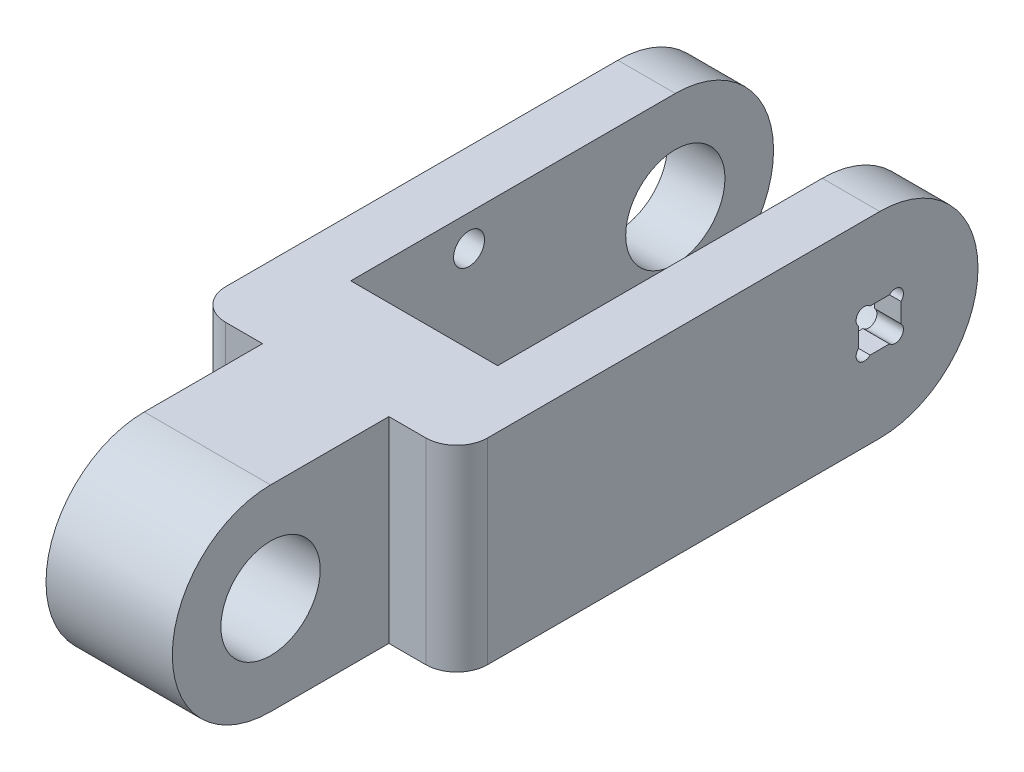
ISO-10303-21;
HEADER;
FILE_DESCRIPTION(('STEP AP214'),'2;1');
FILE_NAME('part.step','',(''),(''),'','','');
FILE_SCHEMA(('AUTOMOTIVE_DESIGN { 1 0 10303 214 1 1 1 1 }'));
ENDSEC;
DATA;
#1=APPLICATION_CONTEXT('core data for automotive mechanical design processes');
#2=APPLICATION_PROTOCOL_DEFINITION('international standard','automotive_design',2000,#1);
#3=PRODUCT_CONTEXT('',#1,'mechanical');
#4=PRODUCT('Part','Part','',(#3));
#5=PRODUCT_RELATED_PRODUCT_CATEGORY('part','',(#4));
#6=PRODUCT_DEFINITION_FORMATION('','',#4);
#7=PRODUCT_DEFINITION_CONTEXT('part definition',#1,'design');
#8=PRODUCT_DEFINITION('design','',#6,#7);
#9=PRODUCT_DEFINITION_SHAPE('','',#8);
#10=(LENGTH_UNIT() NAMED_UNIT(*) SI_UNIT(.MILLI.,.METRE.));
#11=(NAMED_UNIT(*) PLANE_ANGLE_UNIT() SI_UNIT($,.RADIAN.));
#12=(NAMED_UNIT(*) SI_UNIT($,.STERADIAN.) SOLID_ANGLE_UNIT());
#13=UNCERTAINTY_MEASURE_WITH_UNIT(LENGTH_MEASURE(1.E-05),#10,'distance_accuracy_value','');
#14=(GEOMETRIC_REPRESENTATION_CONTEXT(3) GLOBAL_UNCERTAINTY_ASSIGNED_CONTEXT((#13)) GLOBAL_UNIT_ASSIGNED_CONTEXT((#10,
#11,#12)) REPRESENTATION_CONTEXT('',''));
#15=CARTESIAN_POINT('',(0.,0.,0.));
#16=DIRECTION('',(0.,0.,1.));
#17=DIRECTION('',(1.,0.,0.));
#18=AXIS2_PLACEMENT_3D('',#15,#16,#17);
#19=CARTESIAN_POINT('',(50.8,-19.05,0.));
#20=DIRECTION('',(0.,1.,0.));
#21=DIRECTION('',(0.,0.,1.));
#22=AXIS2_PLACEMENT_3D('',#19,#20,#21);
#23=PLANE('',#22);
#24=DIRECTION('',(1.,0.,0.));
#25=VECTOR('',#24,1.);
#26=CARTESIAN_POINT('',(50.8,-19.05,29.55));
#27=LINE('',#26,#25);
#28=CARTESIAN_POINT('',(6.,-19.05,29.55));
#29=VERTEX_POINT('',#28);
#30=CARTESIAN_POINT('',(13.15,-19.05,29.55));
#31=VERTEX_POINT('',#30);
#32=EDGE_CURVE('E243',#29,#31,#27,.T.);
#33=ORIENTED_EDGE('',*,*,#32,.F.);
#34=CARTESIAN_POINT('',(6.,-19.05,23.55));
#35=DIRECTION('',(0.,1.,0.));
#36=DIRECTION('',(0.,0.,1.));
#37=AXIS2_PLACEMENT_3D('',#34,#35,#36);
#38=CIRCLE('',#37,6.);
#39=CARTESIAN_POINT('',(0.,-19.05,23.55));
#40=VERTEX_POINT('',#39);
#41=EDGE_CURVE('E329',#29,#40,#38,.F.);
#42=ORIENTED_EDGE('',*,*,#41,.T.);
#43=DIRECTION('',(0.,0.,-1.));
#44=VECTOR('',#43,1.);
#45=CARTESIAN_POINT('',(0.,-19.05,0.));
#46=LINE('',#45,#44);
#47=CARTESIAN_POINT('',(0.,-19.05,-52.5));
#48=VERTEX_POINT('',#47);
#49=EDGE_CURVE('E281',#40,#48,#46,.T.);
#50=ORIENTED_EDGE('',*,*,#49,.T.);
#51=DIRECTION('',(-1.,0.,0.));
#52=VECTOR('',#51,1.);
#53=CARTESIAN_POINT('',(50.8,-19.05,-52.5));
#54=LINE('',#53,#52);
#55=CARTESIAN_POINT('',(11.15,-19.05,-52.5));
#56=VERTEX_POINT('',#55);
#57=EDGE_CURVE('E305',#56,#48,#54,.T.);
#58=ORIENTED_EDGE('',*,*,#57,.F.);
#59=DIRECTION('',(0.,0.,1.));
#60=VECTOR('',#59,1.);
#61=CARTESIAN_POINT('',(11.15,-19.05,0.));
#62=LINE('',#61,#60);
#63=CARTESIAN_POINT('',(11.15,-19.05,10.45));
#64=VERTEX_POINT('',#63);
#65=EDGE_CURVE('E271',#56,#64,#62,.T.);
#66=ORIENTED_EDGE('',*,*,#65,.T.);
#67=DIRECTION('',(1.,0.,0.));
#68=VECTOR('',#67,1.);
#69=CARTESIAN_POINT('',(50.8,-19.05,10.45));
#70=LINE('',#69,#68);
#71=CARTESIAN_POINT('',(39.65,-19.05,10.45));
#72=VERTEX_POINT('',#71);
#73=EDGE_CURVE('E274',#64,#72,#70,.T.);
#74=ORIENTED_EDGE('',*,*,#73,.T.);
#75=DIRECTION('',(0.,0.,1.));
#76=VECTOR('',#75,1.);
#77=CARTESIAN_POINT('',(39.65,-19.05,0.));
#78=LINE('',#77,#76);
#79=CARTESIAN_POINT('',(39.65,-19.05,-52.5));
#80=VERTEX_POINT('',#79);
#81=EDGE_CURVE('E279',#80,#72,#78,.T.);
#82=ORIENTED_EDGE('',*,*,#81,.F.);
#83=CARTESIAN_POINT('',(50.8,-19.05,-52.5));
#84=VERTEX_POINT('',#83);
#85=EDGE_CURVE('E306',#84,#80,#54,.T.);
#86=ORIENTED_EDGE('',*,*,#85,.F.);
#87=DIRECTION('',(0.,0.,-1.));
#88=VECTOR('',#87,1.);
#89=CARTESIAN_POINT('',(50.8,-19.05,0.));
#90=LINE('',#89,#88);
#91=CARTESIAN_POINT('',(50.8,-19.05,23.55));
#92=VERTEX_POINT('',#91);
#93=EDGE_CURVE('E282',#92,#84,#90,.T.);
#94=ORIENTED_EDGE('',*,*,#93,.F.);
#95=CARTESIAN_POINT('',(44.8,-19.05,23.55));
#96=DIRECTION('',(0.,1.,0.));
#97=DIRECTION('',(0.,0.,1.));
#98=AXIS2_PLACEMENT_3D('',#95,#96,#97);
#99=CIRCLE('',#98,6.);
#100=CARTESIAN_POINT('',(44.8,-19.05,29.55));
#101=VERTEX_POINT('',#100);
#102=EDGE_CURVE('E327',#92,#101,#99,.F.);
#103=ORIENTED_EDGE('',*,*,#102,.T.);
#104=DIRECTION('',(1.,0.,0.));
#105=VECTOR('',#104,1.);
#106=CARTESIAN_POINT('',(50.8,-19.05,29.55));
#107=LINE('',#106,#105);
#108=CARTESIAN_POINT('',(37.65,-19.05,29.55));
#109=VERTEX_POINT('',#108);
#110=EDGE_CURVE('E255',#109,#101,#107,.T.);
#111=ORIENTED_EDGE('',*,*,#110,.F.);
#112=DIRECTION('',(0.,0.,1.));
#113=VECTOR('',#112,1.);
#114=CARTESIAN_POINT('',(37.65,-19.05,0.));
#115=LINE('',#114,#113);
#116=CARTESIAN_POINT('',(37.65,-19.05,52.5));
#117=VERTEX_POINT('',#116);
#118=EDGE_CURVE('E258',#109,#117,#115,.T.);
#119=ORIENTED_EDGE('',*,*,#118,.T.);
#120=DIRECTION('',(-1.,0.,0.));
#121=VECTOR('',#120,1.);
#122=CARTESIAN_POINT('',(50.8,-19.05,52.5));
#123=LINE('',#122,#121);
#124=CARTESIAN_POINT('',(13.15,-19.05,52.5));
#125=VERTEX_POINT('',#124);
#126=EDGE_CURVE('E290',#117,#125,#123,.T.);
#127=ORIENTED_EDGE('',*,*,#126,.T.);
#128=DIRECTION('',(0.,0.,-1.));
#129=VECTOR('',#128,1.);
#130=CARTESIAN_POINT('',(13.15,-19.05,0.));
#131=LINE('',#130,#129);
#132=EDGE_CURVE('E245',#125,#31,#131,.T.);
#133=ORIENTED_EDGE('',*,*,#132,.T.);
#134=EDGE_LOOP('',(#33,#42,#50,#58,#66,#74,#82,#86,#94,#103,#111,#119,#127,#133));
#135=FACE_BOUND('',#134,.T.);
#136=ADVANCED_FACE('F39',(#135),#23,.F.);
#137=CARTESIAN_POINT('',(50.8,19.05,0.));
#138=DIRECTION('',(0.,1.,0.));
#139=DIRECTION('',(0.,0.,1.));
#140=AXIS2_PLACEMENT_3D('',#137,#138,#139);
#141=PLANE('',#140);
#142=DIRECTION('',(0.,0.,-1.));
#143=VECTOR('',#142,1.);
#144=CARTESIAN_POINT('',(0.,19.05,0.));
#145=LINE('',#144,#143);
#146=CARTESIAN_POINT('',(0.,19.05,23.55));
#147=VERTEX_POINT('',#146);
#148=CARTESIAN_POINT('',(0.,19.05,-52.5));
#149=VERTEX_POINT('',#148);
#150=EDGE_CURVE('E285',#147,#149,#145,.T.);
#151=ORIENTED_EDGE('',*,*,#150,.F.);
#152=CARTESIAN_POINT('',(6.,19.05,23.55));
#153=DIRECTION('',(0.,1.,0.));
#154=DIRECTION('',(0.,0.,1.));
#155=AXIS2_PLACEMENT_3D('',#152,#153,#154);
#156=CIRCLE('',#155,6.);
#157=CARTESIAN_POINT('',(6.,19.05,29.55));
#158=VERTEX_POINT('',#157);
#159=EDGE_CURVE('E334',#147,#158,#156,.T.);
#160=ORIENTED_EDGE('',*,*,#159,.T.);
#161=DIRECTION('',(1.,0.,0.));
#162=VECTOR('',#161,1.);
#163=CARTESIAN_POINT('',(0.,19.05,29.55));
#164=LINE('',#163,#162);
#165=CARTESIAN_POINT('',(13.15,19.05,29.55));
#166=VERTEX_POINT('',#165);
#167=EDGE_CURVE('E238',#158,#166,#164,.T.);
#168=ORIENTED_EDGE('',*,*,#167,.T.);
#169=DIRECTION('',(0.,0.,-1.));
#170=VECTOR('',#169,1.);
#171=CARTESIAN_POINT('',(13.15,19.05,71.55));
#172=LINE('',#171,#170);
#173=CARTESIAN_POINT('',(13.15,19.05,52.5));
#174=VERTEX_POINT('',#173);
#175=EDGE_CURVE('E240',#174,#166,#172,.T.);
#176=ORIENTED_EDGE('',*,*,#175,.F.);
#177=DIRECTION('',(-1.,0.,0.));
#178=VECTOR('',#177,1.);
#179=CARTESIAN_POINT('',(50.8,19.05,52.5));
#180=LINE('',#179,#178);
#181=CARTESIAN_POINT('',(37.65,19.05,52.5));
#182=VERTEX_POINT('',#181);
#183=EDGE_CURVE('E298',#182,#174,#180,.T.);
#184=ORIENTED_EDGE('',*,*,#183,.F.);
#185=DIRECTION('',(0.,0.,1.));
#186=VECTOR('',#185,1.);
#187=CARTESIAN_POINT('',(37.65,19.05,29.55));
#188=LINE('',#187,#186);
#189=CARTESIAN_POINT('',(37.65,19.05,29.55));
#190=VERTEX_POINT('',#189);
#191=EDGE_CURVE('E250',#190,#182,#188,.T.);
#192=ORIENTED_EDGE('',*,*,#191,.F.);
#193=DIRECTION('',(1.,0.,0.));
#194=VECTOR('',#193,1.);
#195=CARTESIAN_POINT('',(37.65,19.05,29.55));
#196=LINE('',#195,#194);
#197=CARTESIAN_POINT('',(44.8,19.05,29.55));
#198=VERTEX_POINT('',#197);
#199=EDGE_CURVE('E253',#190,#198,#196,.T.);
#200=ORIENTED_EDGE('',*,*,#199,.T.);
#201=CARTESIAN_POINT('',(44.8,19.05,23.55));
#202=DIRECTION('',(0.,1.,0.));
#203=DIRECTION('',(0.,0.,1.));
#204=AXIS2_PLACEMENT_3D('',#201,#202,#203);
#205=CIRCLE('',#204,6.);
#206=CARTESIAN_POINT('',(50.8,19.05,23.55));
#207=VERTEX_POINT('',#206);
#208=EDGE_CURVE('E62',#198,#207,#205,.T.);
#209=ORIENTED_EDGE('',*,*,#208,.T.);
#210=DIRECTION('',(0.,0.,-1.));
#211=VECTOR('',#210,1.);
#212=CARTESIAN_POINT('',(50.8,19.05,0.));
#213=LINE('',#212,#211);
#214=CARTESIAN_POINT('',(50.8,19.05,-52.5));
#215=VERTEX_POINT('',#214);
#216=EDGE_CURVE('E288',#207,#215,#213,.T.);
#217=ORIENTED_EDGE('',*,*,#216,.T.);
#218=DIRECTION('',(-1.,0.,0.));
#219=VECTOR('',#218,1.);
#220=CARTESIAN_POINT('',(50.8,19.05,-52.5));
#221=LINE('',#220,#219);
#222=CARTESIAN_POINT('',(39.65,19.05,-52.5));
#223=VERTEX_POINT('',#222);
#224=EDGE_CURVE('E302',#215,#223,#221,.T.);
#225=ORIENTED_EDGE('',*,*,#224,.T.);
#226=DIRECTION('',(0.,0.,1.));
#227=VECTOR('',#226,1.);
#228=CARTESIAN_POINT('',(39.65,19.05,0.));
#229=LINE('',#228,#227);
#230=CARTESIAN_POINT('',(39.65,19.05,10.45));
#231=VERTEX_POINT('',#230);
#232=EDGE_CURVE('E312',#223,#231,#229,.T.);
#233=ORIENTED_EDGE('',*,*,#232,.T.);
#234=DIRECTION('',(1.,0.,0.));
#235=VECTOR('',#234,1.);
#236=CARTESIAN_POINT('',(0.,19.05,10.45));
#237=LINE('',#236,#235);
#238=CARTESIAN_POINT('',(11.15,19.05,10.45));
#239=VERTEX_POINT('',#238);
#240=EDGE_CURVE('E261',#239,#231,#237,.T.);
#241=ORIENTED_EDGE('',*,*,#240,.F.);
#242=DIRECTION('',(0.,0.,1.));
#243=VECTOR('',#242,1.);
#244=CARTESIAN_POINT('',(11.15,19.05,0.));
#245=LINE('',#244,#243);
#246=CARTESIAN_POINT('',(11.15,19.05,-52.5));
#247=VERTEX_POINT('',#246);
#248=EDGE_CURVE('E309',#247,#239,#245,.T.);
#249=ORIENTED_EDGE('',*,*,#248,.F.);
#250=EDGE_CURVE('E301',#247,#149,#221,.T.);
#251=ORIENTED_EDGE('',*,*,#250,.T.);
#252=EDGE_LOOP('',(#151,#160,#168,#176,#184,#192,#200,#209,#217,#225,#233,#241,#249,#251));
#253=FACE_BOUND('',#252,.T.);
#254=ADVANCED_FACE('F352',(#253),#141,.T.);
#255=CARTESIAN_POINT('',(0.,0.,0.));
#256=DIRECTION('',(1.,0.,0.));
#257=DIRECTION('',(0.,0.,-1.));
#258=AXIS2_PLACEMENT_3D('',#255,#256,#257);
#259=PLANE('',#258);
#260=CARTESIAN_POINT('',(0.,-13.,-12.5));
#261=DIRECTION('',(-1.,0.,0.));
#262=DIRECTION('',(0.,0.,-1.));
#263=AXIS2_PLACEMENT_3D('',#260,#261,#262);
#264=CIRCLE('',#263,3.);
#265=CARTESIAN_POINT('',(0.,-13.,-15.5));
#266=VERTEX_POINT('',#265);
#267=EDGE_CURVE('E487',#266,#266,#264,.T.);
#268=ORIENTED_EDGE('',*,*,#267,.F.);
#269=EDGE_LOOP('',(#268));
#270=FACE_BOUND('',#269,.T.);
#271=CARTESIAN_POINT('',(0.,13.,-12.5));
#272=DIRECTION('',(-1.,0.,0.));
#273=DIRECTION('',(0.,0.,1.));
#274=AXIS2_PLACEMENT_3D('',#271,#272,#273);
#275=CIRCLE('',#274,3.);
#276=CARTESIAN_POINT('',(0.,13.,-9.49999999999999));
#277=VERTEX_POINT('',#276);
#278=EDGE_CURVE('E491',#277,#277,#275,.T.);
#279=ORIENTED_EDGE('',*,*,#278,.F.);
#280=EDGE_LOOP('',(#279));
#281=FACE_BOUND('',#280,.T.);
#282=CARTESIAN_POINT('',(0.,0.,-52.5));
#283=DIRECTION('',(1.,0.,0.));
#284=DIRECTION('',(0.,0.,-1.));
#285=AXIS2_PLACEMENT_3D('',#282,#283,#284);
#286=CIRCLE('',#285,9.625);
#287=CARTESIAN_POINT('',(0.,0.,-62.125));
#288=VERTEX_POINT('',#287);
#289=EDGE_CURVE('E223',#288,#288,#286,.T.);
#290=ORIENTED_EDGE('',*,*,#289,.T.);
#291=EDGE_LOOP('',(#290));
#292=FACE_BOUND('',#291,.T.);
#293=ORIENTED_EDGE('',*,*,#49,.F.);
#294=DIRECTION('',(0.,-1.,0.));
#295=VECTOR('',#294,1.);
#296=CARTESIAN_POINT('',(0.,19.05,23.55));
#297=LINE('',#296,#295);
#298=EDGE_CURVE('E331',#40,#147,#297,.F.);
#299=ORIENTED_EDGE('',*,*,#298,.T.);
#300=ORIENTED_EDGE('',*,*,#150,.T.);
#301=CARTESIAN_POINT('',(0.,0.,-52.5));
#302=DIRECTION('',(1.,0.,0.));
#303=DIRECTION('',(0.,0.,-1.));
#304=AXIS2_PLACEMENT_3D('',#301,#302,#303);
#305=CIRCLE('',#304,19.05);
#306=EDGE_CURVE('E292',#48,#149,#305,.T.);
#307=ORIENTED_EDGE('',*,*,#306,.F.);
#308=EDGE_LOOP('',(#293,#299,#300,#307));
#309=FACE_BOUND('',#308,.T.);
#310=ADVANCED_FACE('F372',(#270,#281,#292,#309),#259,.F.);
#311=CARTESIAN_POINT('',(50.8,0.,0.));
#312=DIRECTION('',(1.,0.,0.));
#313=DIRECTION('',(0.,0.,-1.));
#314=AXIS2_PLACEMENT_3D('',#311,#312,#313);
#315=PLANE('',#314);
#316=CARTESIAN_POINT('',(50.8,-3.00246798486635,-49.4975320151336));
#317=DIRECTION('',(1.,0.,0.));
#318=DIRECTION('',(0.,0.,1.));
#319=AXIS2_PLACEMENT_3D('',#316,#317,#318);
#320=CIRCLE('',#319,1.58750000000001);
#321=CARTESIAN_POINT('',(50.8,-1.87993596973267,-48.375));
#322=VERTEX_POINT('',#321);
#323=CARTESIAN_POINT('',(50.8,-4.12499999999998,-50.6200640302673));
#324=VERTEX_POINT('',#323);
#325=EDGE_CURVE('E195',#322,#324,#320,.T.);
#326=ORIENTED_EDGE('',*,*,#325,.F.);
#327=DIRECTION('',(0.,-1.,0.));
#328=VECTOR('',#327,1.);
#329=CARTESIAN_POINT('',(50.8,-4.12499999999998,-48.375));
#330=LINE('',#329,#328);
#331=CARTESIAN_POINT('',(50.8,1.87993596973275,-48.375));
#332=VERTEX_POINT('',#331);
#333=EDGE_CURVE('E203',#332,#322,#330,.T.);
#334=ORIENTED_EDGE('',*,*,#333,.F.);
#335=CARTESIAN_POINT('',(50.8,3.00246798486638,-49.4975320151337));
#336=DIRECTION('',(1.,0.,0.));
#337=DIRECTION('',(0.,0.,-1.));
#338=AXIS2_PLACEMENT_3D('',#335,#336,#337);
#339=CIRCLE('',#338,1.5875);
#340=CARTESIAN_POINT('',(50.8,4.12500000000002,-50.6200640302673));
#341=VERTEX_POINT('',#340);
#342=EDGE_CURVE('E524',#341,#332,#339,.T.);
#343=ORIENTED_EDGE('',*,*,#342,.F.);
#344=DIRECTION('',(0.,0.,1.));
#345=VECTOR('',#344,1.);
#346=CARTESIAN_POINT('',(50.8,4.12500000000002,-56.625));
#347=LINE('',#346,#345);
#348=CARTESIAN_POINT('',(50.8,4.12500000000002,-54.3799359697327));
#349=VERTEX_POINT('',#348);
#350=EDGE_CURVE('E527',#349,#341,#347,.T.);
#351=ORIENTED_EDGE('',*,*,#350,.F.);
#352=CARTESIAN_POINT('',(50.8,3.00246798486638,-55.5024679848664));
#353=DIRECTION('',(1.,0.,0.));
#354=DIRECTION('',(0.,0.,1.));
#355=AXIS2_PLACEMENT_3D('',#352,#353,#354);
#356=CIRCLE('',#355,1.5875);
#357=CARTESIAN_POINT('',(50.8,1.87993596973274,-56.625));
#358=VERTEX_POINT('',#357);
#359=EDGE_CURVE('E517',#358,#349,#356,.T.);
#360=ORIENTED_EDGE('',*,*,#359,.F.);
#361=DIRECTION('',(0.,1.,0.));
#362=VECTOR('',#361,1.);
#363=CARTESIAN_POINT('',(50.8,-4.12499999999998,-56.625));
#364=LINE('',#363,#362);
#365=CARTESIAN_POINT('',(50.8,-1.8799359697328,-56.625));
#366=VERTEX_POINT('',#365);
#367=EDGE_CURVE('E529',#366,#358,#364,.T.);
#368=ORIENTED_EDGE('',*,*,#367,.F.);
#369=CARTESIAN_POINT('',(50.8,-3.00246798486641,-55.5024679848663));
#370=DIRECTION('',(1.,0.,0.));
#371=DIRECTION('',(0.,0.,-1.));
#372=AXIS2_PLACEMENT_3D('',#369,#370,#371);
#373=CIRCLE('',#372,1.5875);
#374=CARTESIAN_POINT('',(50.8,-4.12499999999998,-54.3799359697326));
#375=VERTEX_POINT('',#374);
#376=EDGE_CURVE('E510',#375,#366,#373,.T.);
#377=ORIENTED_EDGE('',*,*,#376,.F.);
#378=DIRECTION('',(0.,0.,-1.));
#379=VECTOR('',#378,1.);
#380=CARTESIAN_POINT('',(50.8,-4.12499999999998,-56.625));
#381=LINE('',#380,#379);
#382=EDGE_CURVE('E217',#324,#375,#381,.T.);
#383=ORIENTED_EDGE('',*,*,#382,.F.);
#384=EDGE_LOOP('',(#326,#334,#343,#351,#360,#368,#377,#383));
#385=FACE_BOUND('',#384,.T.);
#386=ORIENTED_EDGE('',*,*,#216,.F.);
#387=DIRECTION('',(0.,-1.,0.));
#388=VECTOR('',#387,1.);
#389=CARTESIAN_POINT('',(50.8,0.,23.55));
#390=LINE('',#389,#388);
#391=EDGE_CURVE('E47',#207,#92,#390,.T.);
#392=ORIENTED_EDGE('',*,*,#391,.T.);
#393=ORIENTED_EDGE('',*,*,#93,.T.);
#394=CARTESIAN_POINT('',(50.8,0.,-52.5));
#395=DIRECTION('',(1.,0.,0.));
#396=DIRECTION('',(0.,0.,-1.));
#397=AXIS2_PLACEMENT_3D('',#394,#395,#396);
#398=CIRCLE('',#397,19.05);
#399=EDGE_CURVE('E284',#84,#215,#398,.T.);
#400=ORIENTED_EDGE('',*,*,#399,.T.);
#401=EDGE_LOOP('',(#386,#392,#393,#400));
#402=FACE_BOUND('',#401,.T.);
#403=ADVANCED_FACE('F339',(#385,#402),#315,.T.);
#404=CARTESIAN_POINT('',(50.8,0.,-52.5));
#405=DIRECTION('',(-1.,0.,0.));
#406=DIRECTION('',(0.,0.,1.));
#407=AXIS2_PLACEMENT_3D('',#404,#405,#406);
#408=CYLINDRICAL_SURFACE('',#407,19.05);
#409=CARTESIAN_POINT('',(39.65,0.,-52.5));
#410=DIRECTION('',(-1.,0.,0.));
#411=DIRECTION('',(0.,0.,1.));
#412=AXIS2_PLACEMENT_3D('',#409,#410,#411);
#413=CIRCLE('',#412,19.05);
#414=EDGE_CURVE('E277',#223,#80,#413,.T.);
#415=ORIENTED_EDGE('',*,*,#414,.F.);
#416=ORIENTED_EDGE('',*,*,#224,.F.);
#417=ORIENTED_EDGE('',*,*,#399,.F.);
#418=ORIENTED_EDGE('',*,*,#85,.T.);
#419=EDGE_LOOP('',(#415,#416,#417,#418));
#420=FACE_BOUND('',#419,.T.);
#421=ADVANCED_FACE('F348',(#420),#408,.T.);
#422=ORIENTED_EDGE('',*,*,#250,.F.);
#423=CARTESIAN_POINT('',(11.15,0.,-52.5));
#424=DIRECTION('',(-1.,0.,0.));
#425=DIRECTION('',(0.,0.,1.));
#426=AXIS2_PLACEMENT_3D('',#423,#424,#425);
#427=CIRCLE('',#426,19.05);
#428=EDGE_CURVE('E267',#247,#56,#427,.T.);
#429=ORIENTED_EDGE('',*,*,#428,.T.);
#430=ORIENTED_EDGE('',*,*,#57,.T.);
#431=ORIENTED_EDGE('',*,*,#306,.T.);
#432=EDGE_LOOP('',(#422,#429,#430,#431));
#433=FACE_BOUND('',#432,.T.);
#434=ADVANCED_FACE('F366',(#433),#408,.T.);
#435=CARTESIAN_POINT('',(50.8,0.,52.5));
#436=DIRECTION('',(-1.,0.,0.));
#437=DIRECTION('',(0.,0.,1.));
#438=AXIS2_PLACEMENT_3D('',#435,#436,#437);
#439=CYLINDRICAL_SURFACE('',#438,19.05);
#440=ORIENTED_EDGE('',*,*,#183,.T.);
#441=CARTESIAN_POINT('',(13.15,0.,52.5));
#442=DIRECTION('',(1.,0.,0.));
#443=DIRECTION('',(0.,0.,-1.));
#444=AXIS2_PLACEMENT_3D('',#441,#442,#443);
#445=CIRCLE('',#444,19.05);
#446=EDGE_CURVE('E317',#174,#125,#445,.T.);
#447=ORIENTED_EDGE('',*,*,#446,.T.);
#448=ORIENTED_EDGE('',*,*,#126,.F.);
#449=CARTESIAN_POINT('',(37.65,0.,52.5));
#450=DIRECTION('',(-1.,0.,0.));
#451=DIRECTION('',(0.,0.,1.));
#452=AXIS2_PLACEMENT_3D('',#449,#450,#451);
#453=CIRCLE('',#452,19.05);
#454=EDGE_CURVE('E315',#117,#182,#453,.T.);
#455=ORIENTED_EDGE('',*,*,#454,.T.);
#456=EDGE_LOOP('',(#440,#447,#448,#455));
#457=FACE_BOUND('',#456,.T.);
#458=ADVANCED_FACE('F387',(#457),#439,.T.);
#459=CARTESIAN_POINT('',(39.65,-130.95,0.));
#460=DIRECTION('',(-1.,0.,0.));
#461=DIRECTION('',(0.,0.,1.));
#462=AXIS2_PLACEMENT_3D('',#459,#460,#461);
#463=PLANE('',#462);
#464=CARTESIAN_POINT('',(39.65,0.,-52.5));
#465=DIRECTION('',(-1.,0.,0.));
#466=DIRECTION('',(0.,0.,1.));
#467=AXIS2_PLACEMENT_3D('',#464,#465,#466);
#468=CIRCLE('',#467,9.625);
#469=CARTESIAN_POINT('',(39.65,0.,-42.875));
#470=VERTEX_POINT('',#469);
#471=EDGE_CURVE('E228',#470,#470,#468,.T.);
#472=ORIENTED_EDGE('',*,*,#471,.F.);
#473=EDGE_LOOP('',(#472));
#474=FACE_BOUND('',#473,.T.);
#475=ORIENTED_EDGE('',*,*,#81,.T.);
#476=DIRECTION('',(0.,1.,0.));
#477=VECTOR('',#476,1.);
#478=CARTESIAN_POINT('',(39.65,-130.95,10.45));
#479=LINE('',#478,#477);
#480=EDGE_CURVE('E265',#72,#231,#479,.T.);
#481=ORIENTED_EDGE('',*,*,#480,.T.);
#482=ORIENTED_EDGE('',*,*,#232,.F.);
#483=ORIENTED_EDGE('',*,*,#414,.T.);
#484=EDGE_LOOP('',(#475,#481,#482,#483));
#485=FACE_BOUND('',#484,.T.);
#486=ADVANCED_FACE('F356',(#474,#485),#463,.T.);
#487=CARTESIAN_POINT('',(0.,-130.95,10.45));
#488=DIRECTION('',(0.,0.,1.));
#489=DIRECTION('',(0.,-1.,0.));
#490=AXIS2_PLACEMENT_3D('',#487,#488,#489);
#491=PLANE('',#490);
#492=DIRECTION('',(0.,1.,0.));
#493=VECTOR('',#492,1.);
#494=CARTESIAN_POINT('',(11.15,-130.95,10.45));
#495=LINE('',#494,#493);
#496=EDGE_CURVE('E264',#64,#239,#495,.T.);
#497=ORIENTED_EDGE('',*,*,#496,.T.);
#498=ORIENTED_EDGE('',*,*,#240,.T.);
#499=ORIENTED_EDGE('',*,*,#480,.F.);
#500=ORIENTED_EDGE('',*,*,#73,.F.);
#501=EDGE_LOOP('',(#497,#498,#499,#500));
#502=FACE_BOUND('',#501,.T.);
#503=ADVANCED_FACE('F359',(#502),#491,.F.);
#504=CARTESIAN_POINT('',(11.15,-130.95,0.));
#505=DIRECTION('',(-1.,0.,0.));
#506=DIRECTION('',(0.,0.,1.));
#507=AXIS2_PLACEMENT_3D('',#504,#505,#506);
#508=PLANE('',#507);
#509=CARTESIAN_POINT('',(11.15,-13.,-12.5));
#510=DIRECTION('',(-1.,0.,0.));
#511=DIRECTION('',(0.,0.,1.));
#512=AXIS2_PLACEMENT_3D('',#509,#510,#511);
#513=CIRCLE('',#512,3.);
#514=CARTESIAN_POINT('',(11.15,-13.,-9.49999999999999));
#515=VERTEX_POINT('',#514);
#516=EDGE_CURVE('E490',#515,#515,#513,.F.);
#517=ORIENTED_EDGE('',*,*,#516,.F.);
#518=EDGE_LOOP('',(#517));
#519=FACE_BOUND('',#518,.T.);
#520=CARTESIAN_POINT('',(11.15,13.,-12.5));
#521=DIRECTION('',(-1.,0.,0.));
#522=DIRECTION('',(0.,0.,1.));
#523=AXIS2_PLACEMENT_3D('',#520,#521,#522);
#524=CIRCLE('',#523,3.);
#525=CARTESIAN_POINT('',(11.15,13.,-9.49999999999999));
#526=VERTEX_POINT('',#525);
#527=EDGE_CURVE('E205',#526,#526,#524,.F.);
#528=ORIENTED_EDGE('',*,*,#527,.F.);
#529=EDGE_LOOP('',(#528));
#530=FACE_BOUND('',#529,.T.);
#531=CARTESIAN_POINT('',(11.15,0.,-52.5));
#532=DIRECTION('',(-1.,0.,0.));
#533=DIRECTION('',(0.,0.,1.));
#534=AXIS2_PLACEMENT_3D('',#531,#532,#533);
#535=CIRCLE('',#534,9.625);
#536=CARTESIAN_POINT('',(11.15,0.,-42.875));
#537=VERTEX_POINT('',#536);
#538=EDGE_CURVE('E227',#537,#537,#535,.T.);
#539=ORIENTED_EDGE('',*,*,#538,.T.);
#540=EDGE_LOOP('',(#539));
#541=FACE_BOUND('',#540,.T.);
#542=ORIENTED_EDGE('',*,*,#428,.F.);
#543=ORIENTED_EDGE('',*,*,#248,.T.);
#544=ORIENTED_EDGE('',*,*,#496,.F.);
#545=ORIENTED_EDGE('',*,*,#65,.F.);
#546=EDGE_LOOP('',(#542,#543,#544,#545));
#547=FACE_BOUND('',#546,.T.);
#548=ADVANCED_FACE('F362',(#519,#530,#541,#547),#508,.F.);
#549=CARTESIAN_POINT('',(37.65,-130.95,29.55));
#550=DIRECTION('',(-1.,0.,0.));
#551=DIRECTION('',(0.,0.,1.));
#552=AXIS2_PLACEMENT_3D('',#549,#550,#551);
#553=PLANE('',#552);
#554=CARTESIAN_POINT('',(37.65,0.,52.5));
#555=DIRECTION('',(-1.,0.,0.));
#556=DIRECTION('',(0.,0.,1.));
#557=AXIS2_PLACEMENT_3D('',#554,#555,#556);
#558=CIRCLE('',#557,9.625);
#559=CARTESIAN_POINT('',(37.65,0.,62.125));
#560=VERTEX_POINT('',#559);
#561=EDGE_CURVE('E232',#560,#560,#558,.T.);
#562=ORIENTED_EDGE('',*,*,#561,.T.);
#563=EDGE_LOOP('',(#562));
#564=FACE_BOUND('',#563,.T.);
#565=DIRECTION('',(0.,1.,0.));
#566=VECTOR('',#565,1.);
#567=CARTESIAN_POINT('',(37.65,-130.95,29.55));
#568=LINE('',#567,#566);
#569=EDGE_CURVE('E248',#109,#190,#568,.T.);
#570=ORIENTED_EDGE('',*,*,#569,.T.);
#571=ORIENTED_EDGE('',*,*,#191,.T.);
#572=ORIENTED_EDGE('',*,*,#454,.F.);
#573=ORIENTED_EDGE('',*,*,#118,.F.);
#574=EDGE_LOOP('',(#570,#571,#572,#573));
#575=FACE_BOUND('',#574,.T.);
#576=ADVANCED_FACE('F392',(#564,#575),#553,.F.);
#577=CARTESIAN_POINT('',(37.65,-130.95,29.55));
#578=DIRECTION('',(0.,0.,1.));
#579=DIRECTION('',(1.,0.,0.));
#580=AXIS2_PLACEMENT_3D('',#577,#578,#579);
#581=PLANE('',#580);
#582=ORIENTED_EDGE('',*,*,#110,.T.);
#583=DIRECTION('',(0.,-1.,0.));
#584=VECTOR('',#583,1.);
#585=CARTESIAN_POINT('',(44.8,-130.95,29.55));
#586=LINE('',#585,#584);
#587=EDGE_CURVE('E13',#101,#198,#586,.F.);
#588=ORIENTED_EDGE('',*,*,#587,.T.);
#589=ORIENTED_EDGE('',*,*,#199,.F.);
#590=ORIENTED_EDGE('',*,*,#569,.F.);
#591=EDGE_LOOP('',(#582,#588,#589,#590));
#592=FACE_BOUND('',#591,.T.);
#593=ADVANCED_FACE('F395',(#592),#581,.T.);
#594=CARTESIAN_POINT('',(13.15,-130.95,71.55));
#595=DIRECTION('',(1.,0.,0.));
#596=DIRECTION('',(0.,0.,-1.));
#597=AXIS2_PLACEMENT_3D('',#594,#595,#596);
#598=PLANE('',#597);
#599=CARTESIAN_POINT('',(13.15,0.,52.5));
#600=DIRECTION('',(1.,0.,0.));
#601=DIRECTION('',(0.,0.,-1.));
#602=AXIS2_PLACEMENT_3D('',#599,#600,#601);
#603=CIRCLE('',#602,9.625);
#604=CARTESIAN_POINT('',(13.15,0.,42.875));
#605=VERTEX_POINT('',#604);
#606=EDGE_CURVE('E231',#605,#605,#603,.T.);
#607=ORIENTED_EDGE('',*,*,#606,.T.);
#608=EDGE_LOOP('',(#607));
#609=FACE_BOUND('',#608,.T.);
#610=ORIENTED_EDGE('',*,*,#446,.F.);
#611=ORIENTED_EDGE('',*,*,#175,.T.);
#612=DIRECTION('',(0.,1.,0.));
#613=VECTOR('',#612,1.);
#614=CARTESIAN_POINT('',(13.15,-130.95,29.55));
#615=LINE('',#614,#613);
#616=EDGE_CURVE('E235',#31,#166,#615,.T.);
#617=ORIENTED_EDGE('',*,*,#616,.F.);
#618=ORIENTED_EDGE('',*,*,#132,.F.);
#619=EDGE_LOOP('',(#610,#611,#617,#618));
#620=FACE_BOUND('',#619,.T.);
#621=ADVANCED_FACE('F384',(#609,#620),#598,.F.);
#622=CARTESIAN_POINT('',(0.,-130.95,29.55));
#623=DIRECTION('',(0.,0.,1.));
#624=DIRECTION('',(0.,-1.,0.));
#625=AXIS2_PLACEMENT_3D('',#622,#623,#624);
#626=PLANE('',#625);
#627=ORIENTED_EDGE('',*,*,#167,.F.);
#628=DIRECTION('',(0.,-1.,0.));
#629=VECTOR('',#628,1.);
#630=CARTESIAN_POINT('',(6.,-19.05,29.55));
#631=LINE('',#630,#629);
#632=EDGE_CURVE('E320',#158,#29,#631,.T.);
#633=ORIENTED_EDGE('',*,*,#632,.T.);
#634=ORIENTED_EDGE('',*,*,#32,.T.);
#635=ORIENTED_EDGE('',*,*,#616,.T.);
#636=EDGE_LOOP('',(#627,#633,#634,#635));
#637=FACE_BOUND('',#636,.T.);
#638=ADVANCED_FACE('F380',(#637),#626,.T.);
#639=CARTESIAN_POINT('',(0.,0.,52.5));
#640=DIRECTION('',(1.,0.,0.));
#641=DIRECTION('',(0.,0.,-1.));
#642=AXIS2_PLACEMENT_3D('',#639,#640,#641);
#643=CYLINDRICAL_SURFACE('',#642,9.625);
#644=ORIENTED_EDGE('',*,*,#606,.F.);
#645=EDGE_LOOP('',(#644));
#646=FACE_BOUND('',#645,.T.);
#647=ORIENTED_EDGE('',*,*,#561,.F.);
#648=EDGE_LOOP('',(#647));
#649=FACE_BOUND('',#648,.T.);
#650=ADVANCED_FACE('F438',(#646,#649),#643,.F.);
#651=CARTESIAN_POINT('',(0.,0.,-52.5));
#652=DIRECTION('',(1.,0.,0.));
#653=DIRECTION('',(0.,0.,-1.));
#654=AXIS2_PLACEMENT_3D('',#651,#652,#653);
#655=CYLINDRICAL_SURFACE('',#654,9.625);
#656=ORIENTED_EDGE('',*,*,#289,.F.);
#657=EDGE_LOOP('',(#656));
#658=FACE_BOUND('',#657,.T.);
#659=ORIENTED_EDGE('',*,*,#538,.F.);
#660=EDGE_LOOP('',(#659));
#661=FACE_BOUND('',#660,.T.);
#662=ADVANCED_FACE('F444',(#658,#661),#655,.F.);
#663=CARTESIAN_POINT('',(45.65,0.,-52.5));
#664=DIRECTION('',(-1.,0.,0.));
#665=DIRECTION('',(0.,0.,1.));
#666=AXIS2_PLACEMENT_3D('',#663,#664,#665);
#667=CIRCLE('',#666,9.625);
#668=CARTESIAN_POINT('',(45.65,0.,-42.875));
#669=VERTEX_POINT('',#668);
#670=EDGE_CURVE('E220',#669,#669,#667,.F.);
#671=ORIENTED_EDGE('',*,*,#670,.T.);
#672=EDGE_LOOP('',(#671));
#673=FACE_BOUND('',#672,.T.);
#674=ORIENTED_EDGE('',*,*,#471,.T.);
#675=EDGE_LOOP('',(#674));
#676=FACE_BOUND('',#675,.T.);
#677=ADVANCED_FACE('F446',(#673,#676),#655,.F.);
#678=CARTESIAN_POINT('',(12.4263889243179,-4.12499999999998,-48.375));
#679=DIRECTION('',(0.,0.,1.));
#680=DIRECTION('',(1.,0.,0.));
#681=AXIS2_PLACEMENT_3D('',#678,#679,#680);
#682=PLANE('',#681);
#683=ORIENTED_EDGE('',*,*,#333,.T.);
#684=DIRECTION('',(1.,0.,0.));
#685=VECTOR('',#684,1.);
#686=CARTESIAN_POINT('',(-0.001000000000001,-1.87993596973267,-48.375));
#687=LINE('',#686,#685);
#688=CARTESIAN_POINT('',(45.65,-1.87993596973267,-48.375));
#689=VERTEX_POINT('',#688);
#690=EDGE_CURVE('E189',#689,#322,#687,.T.);
#691=ORIENTED_EDGE('',*,*,#690,.F.);
#692=DIRECTION('',(0.,-1.,0.));
#693=VECTOR('',#692,1.);
#694=CARTESIAN_POINT('',(45.65,-4.12499999999998,-48.375));
#695=LINE('',#694,#693);
#696=CARTESIAN_POINT('',(45.65,1.87993596973275,-48.375));
#697=VERTEX_POINT('',#696);
#698=EDGE_CURVE('E201',#697,#689,#695,.T.);
#699=ORIENTED_EDGE('',*,*,#698,.F.);
#700=DIRECTION('',(1.,0.,0.));
#701=VECTOR('',#700,1.);
#702=CARTESIAN_POINT('',(-0.001000000000001,1.87993596973275,-48.375));
#703=LINE('',#702,#701);
#704=EDGE_CURVE('E504',#332,#697,#703,.F.);
#705=ORIENTED_EDGE('',*,*,#704,.F.);
#706=EDGE_LOOP('',(#683,#691,#699,#705));
#707=FACE_BOUND('',#706,.T.);
#708=ADVANCED_FACE('F199',(#707),#682,.F.);
#709=CARTESIAN_POINT('',(12.4263889243179,4.12500000000002,-56.625));
#710=DIRECTION('',(0.,1.,0.));
#711=DIRECTION('',(0.,0.,1.));
#712=AXIS2_PLACEMENT_3D('',#709,#710,#711);
#713=PLANE('',#712);
#714=DIRECTION('',(0.,0.,1.));
#715=VECTOR('',#714,1.);
#716=CARTESIAN_POINT('',(45.65,4.12500000000002,-56.625));
#717=LINE('',#716,#715);
#718=CARTESIAN_POINT('',(45.65,4.12500000000002,-54.3799359697327));
#719=VERTEX_POINT('',#718);
#720=CARTESIAN_POINT('',(45.65,4.12500000000002,-50.6200640302673));
#721=VERTEX_POINT('',#720);
#722=EDGE_CURVE('E213',#719,#721,#717,.T.);
#723=ORIENTED_EDGE('',*,*,#722,.F.);
#724=DIRECTION('',(1.,0.,0.));
#725=VECTOR('',#724,1.);
#726=CARTESIAN_POINT('',(-0.001000000000001,4.12500000000002,-54.3799359697327));
#727=LINE('',#726,#725);
#728=EDGE_CURVE('E501',#349,#719,#727,.F.);
#729=ORIENTED_EDGE('',*,*,#728,.F.);
#730=ORIENTED_EDGE('',*,*,#350,.T.);
#731=DIRECTION('',(1.,0.,0.));
#732=VECTOR('',#731,1.);
#733=CARTESIAN_POINT('',(-0.001000000000001,4.12500000000002,-50.6200640302673));
#734=LINE('',#733,#732);
#735=EDGE_CURVE('E521',#721,#341,#734,.T.);
#736=ORIENTED_EDGE('',*,*,#735,.F.);
#737=EDGE_LOOP('',(#723,#729,#730,#736));
#738=FACE_BOUND('',#737,.T.);
#739=ADVANCED_FACE('F455',(#738),#713,.F.);
#740=CARTESIAN_POINT('',(12.4263889243179,-4.12499999999998,-56.625));
#741=DIRECTION('',(0.,0.,-1.));
#742=DIRECTION('',(-1.,0.,0.));
#743=AXIS2_PLACEMENT_3D('',#740,#741,#742);
#744=PLANE('',#743);
#745=DIRECTION('',(0.,1.,0.));
#746=VECTOR('',#745,1.);
#747=CARTESIAN_POINT('',(45.65,-4.12499999999998,-56.625));
#748=LINE('',#747,#746);
#749=CARTESIAN_POINT('',(45.65,-1.8799359697328,-56.625));
#750=VERTEX_POINT('',#749);
#751=CARTESIAN_POINT('',(45.65,1.87993596973274,-56.625));
#752=VERTEX_POINT('',#751);
#753=EDGE_CURVE('E215',#750,#752,#748,.T.);
#754=ORIENTED_EDGE('',*,*,#753,.F.);
#755=DIRECTION('',(1.,0.,0.));
#756=VECTOR('',#755,1.);
#757=CARTESIAN_POINT('',(-0.001000000000001,-1.8799359697328,-56.625));
#758=LINE('',#757,#756);
#759=EDGE_CURVE('E204',#366,#750,#758,.F.);
#760=ORIENTED_EDGE('',*,*,#759,.F.);
#761=ORIENTED_EDGE('',*,*,#367,.T.);
#762=DIRECTION('',(1.,0.,0.));
#763=VECTOR('',#762,1.);
#764=CARTESIAN_POINT('',(-0.001000000000001,1.87993596973274,-56.625));
#765=LINE('',#764,#763);
#766=EDGE_CURVE('E514',#752,#358,#765,.T.);
#767=ORIENTED_EDGE('',*,*,#766,.F.);
#768=EDGE_LOOP('',(#754,#760,#761,#767));
#769=FACE_BOUND('',#768,.T.);
#770=ADVANCED_FACE('F458',(#769),#744,.F.);
#771=CARTESIAN_POINT('',(12.4263889243179,-4.12499999999998,-56.625));
#772=DIRECTION('',(0.,-1.,0.));
#773=DIRECTION('',(0.,0.,-1.));
#774=AXIS2_PLACEMENT_3D('',#771,#772,#773);
#775=PLANE('',#774);
#776=DIRECTION('',(0.,0.,-1.));
#777=VECTOR('',#776,1.);
#778=CARTESIAN_POINT('',(45.65,-4.12499999999998,-56.625));
#779=LINE('',#778,#777);
#780=CARTESIAN_POINT('',(45.65,-4.12499999999998,-50.6200640302673));
#781=VERTEX_POINT('',#780);
#782=CARTESIAN_POINT('',(45.65,-4.12499999999998,-54.3799359697326));
#783=VERTEX_POINT('',#782);
#784=EDGE_CURVE('E212',#781,#783,#779,.T.);
#785=ORIENTED_EDGE('',*,*,#784,.F.);
#786=DIRECTION('',(1.,0.,0.));
#787=VECTOR('',#786,1.);
#788=CARTESIAN_POINT('',(-0.001000000000001,-4.12499999999998,-50.6200640302673));
#789=LINE('',#788,#787);
#790=EDGE_CURVE('E54',#324,#781,#789,.F.);
#791=ORIENTED_EDGE('',*,*,#790,.F.);
#792=ORIENTED_EDGE('',*,*,#382,.T.);
#793=DIRECTION('',(1.,0.,0.));
#794=VECTOR('',#793,1.);
#795=CARTESIAN_POINT('',(-0.001000000000001,-4.12499999999998,-54.3799359697326));
#796=LINE('',#795,#794);
#797=EDGE_CURVE('E194',#783,#375,#796,.T.);
#798=ORIENTED_EDGE('',*,*,#797,.F.);
#799=EDGE_LOOP('',(#785,#791,#792,#798));
#800=FACE_BOUND('',#799,.T.);
#801=ADVANCED_FACE('F452',(#800),#775,.F.);
#802=CARTESIAN_POINT('',(45.65,-130.95,0.));
#803=DIRECTION('',(-1.,0.,0.));
#804=DIRECTION('',(0.,0.,1.));
#805=AXIS2_PLACEMENT_3D('',#802,#803,#804);
#806=PLANE('',#805);
#807=ORIENTED_EDGE('',*,*,#698,.T.);
#808=CARTESIAN_POINT('',(45.65,-3.00246798486635,-49.4975320151336));
#809=DIRECTION('',(-1.,0.,0.));
#810=DIRECTION('',(0.,0.,1.));
#811=AXIS2_PLACEMENT_3D('',#808,#809,#810);
#812=CIRCLE('',#811,1.58750000000001);
#813=EDGE_CURVE('E186',#689,#781,#812,.F.);
#814=ORIENTED_EDGE('',*,*,#813,.T.);
#815=ORIENTED_EDGE('',*,*,#784,.T.);
#816=CARTESIAN_POINT('',(45.65,-3.00246798486641,-55.5024679848663));
#817=DIRECTION('',(-1.,0.,0.));
#818=DIRECTION('',(0.,0.,1.));
#819=AXIS2_PLACEMENT_3D('',#816,#817,#818);
#820=CIRCLE('',#819,1.5875);
#821=EDGE_CURVE('E512',#783,#750,#820,.F.);
#822=ORIENTED_EDGE('',*,*,#821,.T.);
#823=ORIENTED_EDGE('',*,*,#753,.T.);
#824=CARTESIAN_POINT('',(45.65,3.00246798486638,-55.5024679848664));
#825=DIRECTION('',(-1.,0.,0.));
#826=DIRECTION('',(0.,0.,1.));
#827=AXIS2_PLACEMENT_3D('',#824,#825,#826);
#828=CIRCLE('',#827,1.5875);
#829=EDGE_CURVE('E519',#752,#719,#828,.F.);
#830=ORIENTED_EDGE('',*,*,#829,.T.);
#831=ORIENTED_EDGE('',*,*,#722,.T.);
#832=CARTESIAN_POINT('',(45.65,3.00246798486638,-49.4975320151337));
#833=DIRECTION('',(-1.,0.,0.));
#834=DIRECTION('',(0.,0.,1.));
#835=AXIS2_PLACEMENT_3D('',#832,#833,#834);
#836=CIRCLE('',#835,1.5875);
#837=EDGE_CURVE('E210',#721,#697,#836,.F.);
#838=ORIENTED_EDGE('',*,*,#837,.T.);
#839=EDGE_LOOP('',(#807,#814,#815,#822,#823,#830,#831,#838));
#840=FACE_BOUND('',#839,.T.);
#841=ORIENTED_EDGE('',*,*,#670,.F.);
#842=EDGE_LOOP('',(#841));
#843=FACE_BOUND('',#842,.T.);
#844=ADVANCED_FACE('F207',(#840,#843),#806,.T.);
#845=CARTESIAN_POINT('',(6.,-130.95,23.55));
#846=DIRECTION('',(0.,1.,0.));
#847=DIRECTION('',(0.,0.,1.));
#848=AXIS2_PLACEMENT_3D('',#845,#846,#847);
#849=CYLINDRICAL_SURFACE('',#848,6.);
#850=ORIENTED_EDGE('',*,*,#159,.F.);
#851=ORIENTED_EDGE('',*,*,#298,.F.);
#852=ORIENTED_EDGE('',*,*,#41,.F.);
#853=ORIENTED_EDGE('',*,*,#632,.F.);
#854=EDGE_LOOP('',(#850,#851,#852,#853));
#855=FACE_BOUND('',#854,.T.);
#856=ADVANCED_FACE('F378',(#855),#849,.T.);
#857=CARTESIAN_POINT('',(44.8,0.,23.55));
#858=DIRECTION('',(0.,-1.,0.));
#859=DIRECTION('',(0.,0.,-1.));
#860=AXIS2_PLACEMENT_3D('',#857,#858,#859);
#861=CYLINDRICAL_SURFACE('',#860,6.);
#862=ORIENTED_EDGE('',*,*,#208,.F.);
#863=ORIENTED_EDGE('',*,*,#587,.F.);
#864=ORIENTED_EDGE('',*,*,#102,.F.);
#865=ORIENTED_EDGE('',*,*,#391,.F.);
#866=EDGE_LOOP('',(#862,#863,#864,#865));
#867=FACE_BOUND('',#866,.T.);
#868=ADVANCED_FACE('F41',(#867),#861,.T.);
#869=CARTESIAN_POINT('',(-0.001000000000001,3.00246798486638,-49.4975320151337));
#870=DIRECTION('',(1.,0.,0.));
#871=DIRECTION('',(0.,0.,-1.));
#872=AXIS2_PLACEMENT_3D('',#869,#870,#871);
#873=CYLINDRICAL_SURFACE('',#872,1.5875);
#874=ORIENTED_EDGE('',*,*,#342,.T.);
#875=ORIENTED_EDGE('',*,*,#704,.T.);
#876=ORIENTED_EDGE('',*,*,#837,.F.);
#877=ORIENTED_EDGE('',*,*,#735,.T.);
#878=EDGE_LOOP('',(#874,#875,#876,#877));
#879=FACE_BOUND('',#878,.T.);
#880=ADVANCED_FACE('F398',(#879),#873,.F.);
#881=CARTESIAN_POINT('',(-0.001000000000001,3.00246798486638,-55.5024679848664));
#882=DIRECTION('',(1.,0.,0.));
#883=DIRECTION('',(0.,0.,-1.));
#884=AXIS2_PLACEMENT_3D('',#881,#882,#883);
#885=CYLINDRICAL_SURFACE('',#884,1.5875);
#886=ORIENTED_EDGE('',*,*,#359,.T.);
#887=ORIENTED_EDGE('',*,*,#728,.T.);
#888=ORIENTED_EDGE('',*,*,#829,.F.);
#889=ORIENTED_EDGE('',*,*,#766,.T.);
#890=EDGE_LOOP('',(#886,#887,#888,#889));
#891=FACE_BOUND('',#890,.T.);
#892=ADVANCED_FACE('F403',(#891),#885,.F.);
#893=CARTESIAN_POINT('',(-0.001000000000001,-3.00246798486641,-55.5024679848663));
#894=DIRECTION('',(1.,0.,0.));
#895=DIRECTION('',(0.,0.,-1.));
#896=AXIS2_PLACEMENT_3D('',#893,#894,#895);
#897=CYLINDRICAL_SURFACE('',#896,1.5875);
#898=ORIENTED_EDGE('',*,*,#376,.T.);
#899=ORIENTED_EDGE('',*,*,#759,.T.);
#900=ORIENTED_EDGE('',*,*,#821,.F.);
#901=ORIENTED_EDGE('',*,*,#797,.T.);
#902=EDGE_LOOP('',(#898,#899,#900,#901));
#903=FACE_BOUND('',#902,.T.);
#904=ADVANCED_FACE('F468',(#903),#897,.F.);
#905=CARTESIAN_POINT('',(-0.001000000000001,-3.00246798486635,-49.4975320151336));
#906=DIRECTION('',(1.,0.,0.));
#907=DIRECTION('',(0.,0.,-1.));
#908=AXIS2_PLACEMENT_3D('',#905,#906,#907);
#909=CYLINDRICAL_SURFACE('',#908,1.58750000000001);
#910=ORIENTED_EDGE('',*,*,#813,.F.);
#911=ORIENTED_EDGE('',*,*,#690,.T.);
#912=ORIENTED_EDGE('',*,*,#325,.T.);
#913=ORIENTED_EDGE('',*,*,#790,.T.);
#914=EDGE_LOOP('',(#910,#911,#912,#913));
#915=FACE_BOUND('',#914,.T.);
#916=ADVANCED_FACE('F188',(#915),#909,.F.);
#917=CARTESIAN_POINT('',(50.801,13.,-12.5));
#918=DIRECTION('',(-1.,0.,0.));
#919=DIRECTION('',(0.,0.,1.));
#920=AXIS2_PLACEMENT_3D('',#917,#918,#919);
#921=CYLINDRICAL_SURFACE('',#920,3.);
#922=ORIENTED_EDGE('',*,*,#278,.T.);
#923=EDGE_LOOP('',(#922));
#924=FACE_BOUND('',#923,.T.);
#925=ORIENTED_EDGE('',*,*,#527,.T.);
#926=EDGE_LOOP('',(#925));
#927=FACE_BOUND('',#926,.T.);
#928=ADVANCED_FACE('F475',(#924,#927),#921,.F.);
#929=CARTESIAN_POINT('',(50.801,-13.,-12.5));
#930=DIRECTION('',(-1.,0.,0.));
#931=DIRECTION('',(0.,0.,1.));
#932=AXIS2_PLACEMENT_3D('',#929,#930,#931);
#933=CYLINDRICAL_SURFACE('',#932,3.);
#934=ORIENTED_EDGE('',*,*,#267,.T.);
#935=EDGE_LOOP('',(#934));
#936=FACE_BOUND('',#935,.T.);
#937=ORIENTED_EDGE('',*,*,#516,.T.);
#938=EDGE_LOOP('',(#937));
#939=FACE_BOUND('',#938,.T.);
#940=ADVANCED_FACE('F478',(#936,#939),#933,.F.);
#941=CLOSED_SHELL('',(#136,#254,#310,#403,#421,#434,#458,#486,#503,#548,#576,#593,#621,#638,
#650,#662,#677,#708,#739,#770,#801,#844,#856,#868,#880,#892,#904,#916,#928,#940));
#942=MANIFOLD_SOLID_BREP('B2',#941);
#943=ADVANCED_BREP_SHAPE_REPRESENTATION('',(#18,#942),#14);
#944=SHAPE_DEFINITION_REPRESENTATION(#9,#943);
ENDSEC;
END-ISO-10303-21;
